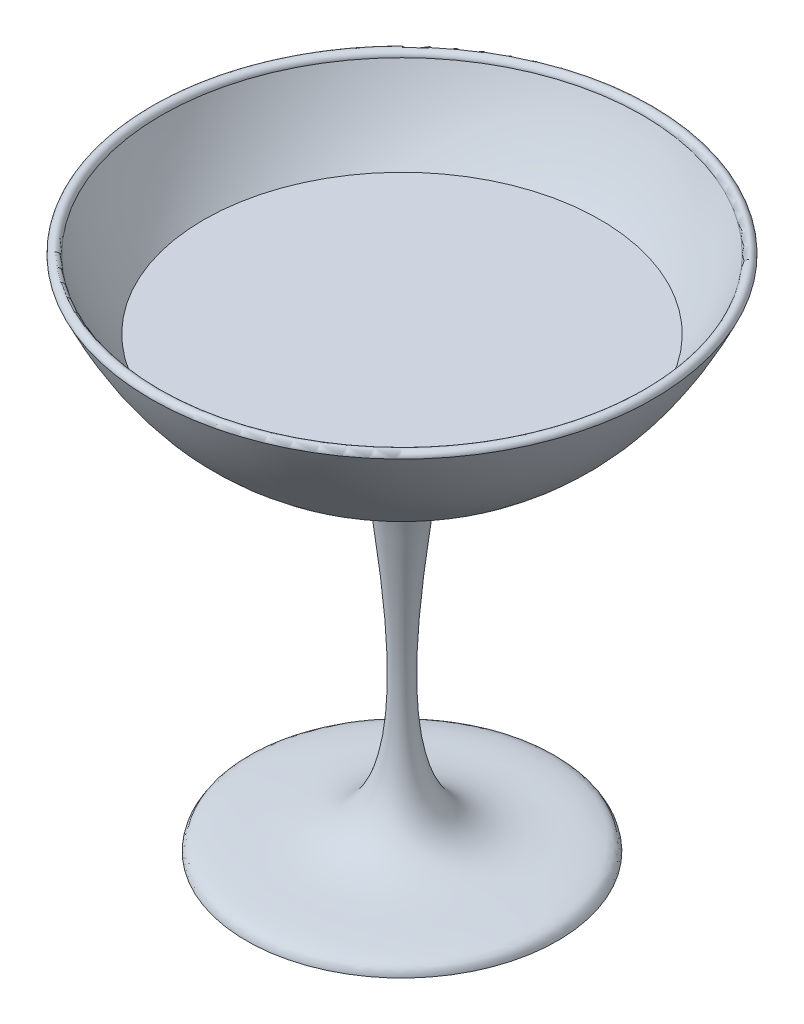
ISO-10303-21;
HEADER;
FILE_DESCRIPTION(('STEP AP214'),'2;1');
FILE_NAME('part.step','',(''),(''),'','','');
FILE_SCHEMA(('AUTOMOTIVE_DESIGN { 1 0 10303 214 1 1 1 1 }'));
ENDSEC;
DATA;
#1=APPLICATION_CONTEXT('core data for automotive mechanical design processes');
#2=APPLICATION_PROTOCOL_DEFINITION('international standard','automotive_design',2000,#1);
#3=PRODUCT_CONTEXT('',#1,'mechanical');
#4=PRODUCT('Part','Part','',(#3));
#5=PRODUCT_RELATED_PRODUCT_CATEGORY('part','',(#4));
#6=PRODUCT_DEFINITION_FORMATION('','',#4);
#7=PRODUCT_DEFINITION_CONTEXT('part definition',#1,'design');
#8=PRODUCT_DEFINITION('design','',#6,#7);
#9=PRODUCT_DEFINITION_SHAPE('','',#8);
#10=(LENGTH_UNIT() NAMED_UNIT(*) SI_UNIT(.MILLI.,.METRE.));
#11=(NAMED_UNIT(*) PLANE_ANGLE_UNIT() SI_UNIT($,.RADIAN.));
#12=(NAMED_UNIT(*) SI_UNIT($,.STERADIAN.) SOLID_ANGLE_UNIT());
#13=UNCERTAINTY_MEASURE_WITH_UNIT(LENGTH_MEASURE(1.E-05),#10,'distance_accuracy_value','');
#14=(GEOMETRIC_REPRESENTATION_CONTEXT(3) GLOBAL_UNCERTAINTY_ASSIGNED_CONTEXT((#13)) GLOBAL_UNIT_ASSIGNED_CONTEXT((#10,
#11,#12)) REPRESENTATION_CONTEXT('',''));
#15=CARTESIAN_POINT('',(0.,0.,0.));
#16=DIRECTION('',(0.,0.,1.));
#17=DIRECTION('',(1.,0.,0.));
#18=AXIS2_PLACEMENT_3D('',#15,#16,#17);
#19=CARTESIAN_POINT('',(0.,65.4067566681124,0.));
#20=CARTESIAN_POINT('',(13.9739178301837,68.0723790153152,0.));
#21=CARTESIAN_POINT('',(27.0369492853302,71.5172506475794,0.));
#22=CARTESIAN_POINT('',(36.55536442818,82.6008029787673,0.));
#23=B_SPLINE_CURVE_WITH_KNOTS('',3,(#19,#20,#21,#22),.UNSPECIFIED.,.F.,.F.,(4,4),(0.,
0.761167440634164),.UNSPECIFIED.);
#24=CARTESIAN_POINT('',(0.,82.6008029787673,0.));
#25=DIRECTION('',(0.,1.,0.));
#26=AXIS1_PLACEMENT('',#24,#25);
#27=SURFACE_OF_REVOLUTION('',#23,#26);
#28=CARTESIAN_POINT('',(0.,82.6008029787673,0.));
#29=DIRECTION('',(0.,1.,0.));
#30=DIRECTION('',(-1.,0.,0.));
#31=AXIS2_PLACEMENT_3D('',#28,#29,#30);
#32=CIRCLE('',#31,36.55536442818);
#33=CARTESIAN_POINT('',(-36.55536442818,82.6008029787673,0.));
#34=VERTEX_POINT('',#33);
#35=EDGE_CURVE('E12',#34,#34,#32,.T.);
#36=ORIENTED_EDGE('',*,*,#35,.F.);
#37=EDGE_LOOP('',(#36));
#38=FACE_BOUND('',#37,.T.);
#39=CARTESIAN_POINT('',(0.,65.4067566681124,0.));
#40=VERTEX_POINT('',#39);
#41=VERTEX_LOOP('',#40);
#42=FACE_BOUND('',#41,.T.);
#43=ADVANCED_FACE('F43',(#38,#42),#27,.T.);
#44=CARTESIAN_POINT('',(0.,82.6008029787673,0.));
#45=DIRECTION('',(0.,-1.,0.));
#46=DIRECTION('',(1.,0.,0.));
#47=AXIS2_PLACEMENT_3D('',#44,#45,#46);
#48=PLANE('',#47);
#49=ORIENTED_EDGE('',*,*,#35,.T.);
#50=EDGE_LOOP('',(#49));
#51=FACE_BOUND('',#50,.T.);
#52=ADVANCED_FACE('F52',(#51),#48,.F.);
#53=CLOSED_SHELL('',(#43,#52));
#54=MANIFOLD_SOLID_BREP('B2',#53);
#55=CARTESIAN_POINT('',(44.3797449806514,95.3699428092453,0.));
#56=CARTESIAN_POINT('',(35.1377317129593,73.6237694035367,0.));
#57=CARTESIAN_POINT('',(18.3585333320896,68.5811287324668,0.));
#58=CARTESIAN_POINT('',(0.,65.0791103789466,0.));
#59=B_SPLINE_CURVE_WITH_KNOTS('',3,(#55,#56,#57,#58),.UNSPECIFIED.,.F.,.F.,(4,4),(0.,1.),.UNSPECIFIED.);
#60=CARTESIAN_POINT('',(0.,0.,0.));
#61=DIRECTION('',(0.,-1.,0.));
#62=AXIS1_PLACEMENT('',#60,#61);
#63=SURFACE_OF_REVOLUTION('',#59,#62);
#64=CARTESIAN_POINT('',(0.,65.0791103789466,0.));
#65=VERTEX_POINT('',#64);
#66=VERTEX_LOOP('',#65);
#67=FACE_BOUND('',#66,.T.);
#68=CARTESIAN_POINT('',(0.,95.3699428092453,0.));
#69=DIRECTION('',(0.,-1.,0.));
#70=DIRECTION('',(0.,0.,-1.));
#71=AXIS2_PLACEMENT_3D('',#68,#69,#70);
#72=CIRCLE('',#71,44.3797449806514);
#73=CARTESIAN_POINT('',(0.,95.3699428092453,-44.3797449806514));
#74=VERTEX_POINT('',#73);
#75=EDGE_CURVE('E41',#74,#74,#72,.T.);
#76=ORIENTED_EDGE('',*,*,#75,.F.);
#77=EDGE_LOOP('',(#76));
#78=FACE_BOUND('',#77,.T.);
#79=ADVANCED_FACE('F78',(#67,#78),#63,.F.);
#80=CARTESIAN_POINT('',(0.,95.3699428092453,0.));
#81=DIRECTION('',(0.,-1.,0.));
#82=DIRECTION('',(0.,0.,-1.));
#83=AXIS2_PLACEMENT_3D('',#80,#81,#82);
#84=TOROIDAL_SURFACE('',#83,45.3482007338219,0.968455753170516);
#85=ORIENTED_EDGE('',*,*,#75,.T.);
#86=EDGE_LOOP('',(#85));
#87=FACE_BOUND('',#86,.T.);
#88=CARTESIAN_POINT('',(0.,95.3699428092454,0.));
#89=DIRECTION('',(0.,-1.,0.));
#90=DIRECTION('',(0.,0.,-1.));
#91=AXIS2_PLACEMENT_3D('',#88,#89,#90);
#92=CIRCLE('',#91,46.3166564869925);
#93=CARTESIAN_POINT('',(0.,95.3699428092454,-46.3166564869925));
#94=VERTEX_POINT('',#93);
#95=EDGE_CURVE('E85',#94,#94,#92,.T.);
#96=ORIENTED_EDGE('',*,*,#95,.F.);
#97=EDGE_LOOP('',(#96));
#98=FACE_BOUND('',#97,.T.);
#99=ADVANCED_FACE('F90',(#87,#98),#84,.T.);
#100=CARTESIAN_POINT('',(28.6799952729233,0.,0.));
#101=CARTESIAN_POINT('',(28.4995503406223,1.47441640809666,0.));
#102=CARTESIAN_POINT('',(23.4477957767796,2.91589720937999,0.));
#103=CARTESIAN_POINT('',(14.9098677419302,2.16503273390511,0.));
#104=CARTESIAN_POINT('',(0.889007043917821,8.95978117156628,0.));
#105=CARTESIAN_POINT('',(1.26862911468861,31.6362919747895,0.));
#106=CARTESIAN_POINT('',(4.86782626907936,61.8551699927748,0.));
#107=CARTESIAN_POINT('',(5.62571258009649,63.4560435110371,0.));
#108=CARTESIAN_POINT('',(23.9428113689708,69.324519639561,0.));
#109=CARTESIAN_POINT('',(37.5230669810139,76.4913333215738,0.));
#110=CARTESIAN_POINT('',(46.3166564869925,95.3699428092454,0.));
#111=B_SPLINE_CURVE_WITH_KNOTS('',3,(#100,#101,#102,#103,#104,#105,#106,#107,#108,#109,#110),
.UNSPECIFIED.,.F.,.F.,(4,1,1,1,1,1,1,1,4),(0.,0.0391904297503419,0.186235893571103,
0.242972377600002,0.549818786010433,0.611419908108723,0.797382476484607,0.838565017778433,1.),.UNSPECIFIED.);
#112=CARTESIAN_POINT('',(0.,0.,0.));
#113=DIRECTION('',(0.,-1.,0.));
#114=AXIS1_PLACEMENT('',#112,#113);
#115=SURFACE_OF_REVOLUTION('',#111,#114);
#116=ORIENTED_EDGE('',*,*,#95,.T.);
#117=EDGE_LOOP('',(#116));
#118=FACE_BOUND('',#117,.T.);
#119=CARTESIAN_POINT('',(0.,0.,0.));
#120=DIRECTION('',(0.,-1.,0.));
#121=DIRECTION('',(0.,0.,-1.));
#122=AXIS2_PLACEMENT_3D('',#119,#120,#121);
#123=CIRCLE('',#122,28.6799952729233);
#124=CARTESIAN_POINT('',(0.,0.,-28.6799952729233));
#125=VERTEX_POINT('',#124);
#126=EDGE_CURVE('E99',#125,#125,#123,.T.);
#127=ORIENTED_EDGE('',*,*,#126,.F.);
#128=EDGE_LOOP('',(#127));
#129=FACE_BOUND('',#128,.T.);
#130=ADVANCED_FACE('F95',(#118,#129),#115,.F.);
#131=CARTESIAN_POINT('',(0.,0.,0.));
#132=DIRECTION('',(0.,-1.,0.));
#133=DIRECTION('',(0.,0.,-1.));
#134=AXIS2_PLACEMENT_3D('',#131,#132,#133);
#135=PLANE('',#134);
#136=ORIENTED_EDGE('',*,*,#126,.T.);
#137=EDGE_LOOP('',(#136));
#138=FACE_BOUND('',#137,.T.);
#139=ADVANCED_FACE('F118',(#138),#135,.T.);
#140=CLOSED_SHELL('',(#79,#99,#130,#139));
#141=MANIFOLD_SOLID_BREP('B6',#140);
#142=ADVANCED_BREP_SHAPE_REPRESENTATION('',(#18,#54,#141),#14);
#143=SHAPE_DEFINITION_REPRESENTATION(#9,#142);
ENDSEC;
END-ISO-10303-21;
